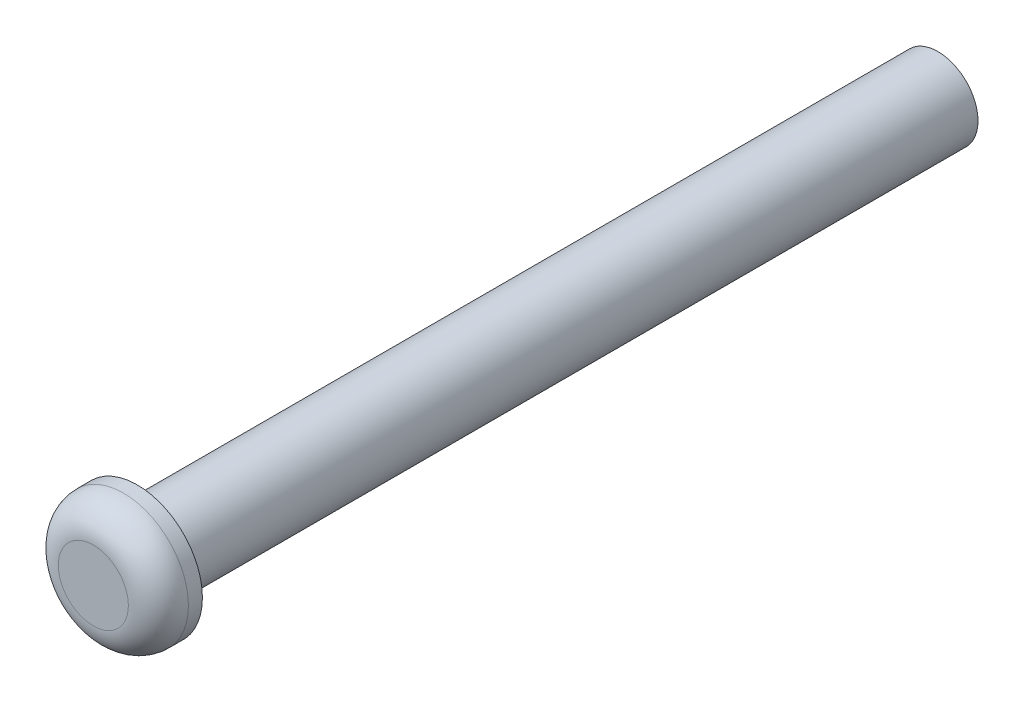
ISO-10303-21;
HEADER;
FILE_DESCRIPTION(('STEP AP214'),'2;1');
FILE_NAME('part.step','',(''),(''),'','','');
FILE_SCHEMA(('AUTOMOTIVE_DESIGN { 1 0 10303 214 1 1 1 1 }'));
ENDSEC;
DATA;
#1=APPLICATION_CONTEXT('core data for automotive mechanical design processes');
#2=APPLICATION_PROTOCOL_DEFINITION('international standard','automotive_design',2000,#1);
#3=PRODUCT_CONTEXT('',#1,'mechanical');
#4=PRODUCT('Part','Part','',(#3));
#5=PRODUCT_RELATED_PRODUCT_CATEGORY('part','',(#4));
#6=PRODUCT_DEFINITION_FORMATION('','',#4);
#7=PRODUCT_DEFINITION_CONTEXT('part definition',#1,'design');
#8=PRODUCT_DEFINITION('design','',#6,#7);
#9=PRODUCT_DEFINITION_SHAPE('','',#8);
#10=(LENGTH_UNIT() NAMED_UNIT(*) SI_UNIT(.MILLI.,.METRE.));
#11=(NAMED_UNIT(*) PLANE_ANGLE_UNIT() SI_UNIT($,.RADIAN.));
#12=(NAMED_UNIT(*) SI_UNIT($,.STERADIAN.) SOLID_ANGLE_UNIT());
#13=UNCERTAINTY_MEASURE_WITH_UNIT(LENGTH_MEASURE(1.E-05),#10,'distance_accuracy_value','');
#14=(GEOMETRIC_REPRESENTATION_CONTEXT(3) GLOBAL_UNCERTAINTY_ASSIGNED_CONTEXT((#13)) GLOBAL_UNIT_ASSIGNED_CONTEXT((#10,
#11,#12)) REPRESENTATION_CONTEXT('',''));
#15=CARTESIAN_POINT('',(0.,0.,0.));
#16=DIRECTION('',(0.,0.,1.));
#17=DIRECTION('',(1.,0.,0.));
#18=AXIS2_PLACEMENT_3D('',#15,#16,#17);
#19=CARTESIAN_POINT('',(0.,0.,40.));
#20=DIRECTION('',(0.,0.,-1.));
#21=DIRECTION('',(-1.,0.,0.));
#22=AXIS2_PLACEMENT_3D('',#19,#20,#21);
#23=CYLINDRICAL_SURFACE('',#22,2.);
#24=CARTESIAN_POINT('',(0.,0.,40.));
#25=DIRECTION('',(0.,0.,1.));
#26=DIRECTION('',(1.,0.,0.));
#27=AXIS2_PLACEMENT_3D('',#24,#25,#26);
#28=CIRCLE('',#27,2.);
#29=CARTESIAN_POINT('',(2.,0.,40.));
#30=VERTEX_POINT('',#29);
#31=EDGE_CURVE('E42',#30,#30,#28,.T.);
#32=ORIENTED_EDGE('',*,*,#31,.F.);
#33=EDGE_LOOP('',(#32));
#34=FACE_BOUND('',#33,.T.);
#35=CARTESIAN_POINT('',(0.,0.,0.));
#36=DIRECTION('',(0.,0.,1.));
#37=DIRECTION('',(1.,0.,0.));
#38=AXIS2_PLACEMENT_3D('',#35,#36,#37);
#39=CIRCLE('',#38,2.);
#40=CARTESIAN_POINT('',(2.,0.,0.));
#41=VERTEX_POINT('',#40);
#42=EDGE_CURVE('E46',#41,#41,#39,.T.);
#43=ORIENTED_EDGE('',*,*,#42,.T.);
#44=EDGE_LOOP('',(#43));
#45=FACE_BOUND('',#44,.T.);
#46=ADVANCED_FACE('F31',(#34,#45),#23,.T.);
#47=CARTESIAN_POINT('',(0.,0.,0.));
#48=DIRECTION('',(0.,0.,1.));
#49=DIRECTION('',(1.,0.,0.));
#50=AXIS2_PLACEMENT_3D('',#47,#48,#49);
#51=PLANE('',#50);
#52=ORIENTED_EDGE('',*,*,#42,.F.);
#53=EDGE_LOOP('',(#52));
#54=FACE_BOUND('',#53,.T.);
#55=ADVANCED_FACE('F70',(#54),#51,.F.);
#56=CARTESIAN_POINT('',(0.,0.,42.2));
#57=DIRECTION('',(0.,0.,-1.));
#58=DIRECTION('',(-1.,0.,0.));
#59=AXIS2_PLACEMENT_3D('',#56,#57,#58);
#60=CYLINDRICAL_SURFACE('',#59,3.25);
#61=CARTESIAN_POINT('',(0.,0.,40.7));
#62=DIRECTION('',(0.,0.,1.));
#63=DIRECTION('',(1.,0.,0.));
#64=AXIS2_PLACEMENT_3D('',#61,#62,#63);
#65=CIRCLE('',#64,3.25);
#66=CARTESIAN_POINT('',(3.25,0.,40.7));
#67=VERTEX_POINT('',#66);
#68=EDGE_CURVE('E10',#67,#67,#65,.F.);
#69=ORIENTED_EDGE('',*,*,#68,.T.);
#70=EDGE_LOOP('',(#69));
#71=FACE_BOUND('',#70,.T.);
#72=CARTESIAN_POINT('',(0.,0.,40.));
#73=DIRECTION('',(0.,0.,1.));
#74=DIRECTION('',(1.,0.,0.));
#75=AXIS2_PLACEMENT_3D('',#72,#73,#74);
#76=CIRCLE('',#75,3.25);
#77=CARTESIAN_POINT('',(3.25,0.,40.));
#78=VERTEX_POINT('',#77);
#79=EDGE_CURVE('E50',#78,#78,#76,.T.);
#80=ORIENTED_EDGE('',*,*,#79,.T.);
#81=EDGE_LOOP('',(#80));
#82=FACE_BOUND('',#81,.T.);
#83=ADVANCED_FACE('F55',(#71,#82),#60,.T.);
#84=CARTESIAN_POINT('',(0.,0.,42.2));
#85=DIRECTION('',(0.,0.,1.));
#86=DIRECTION('',(1.,0.,0.));
#87=AXIS2_PLACEMENT_3D('',#84,#85,#86);
#88=PLANE('',#87);
#89=CARTESIAN_POINT('',(0.,0.,42.2));
#90=DIRECTION('',(0.,0.,1.));
#91=DIRECTION('',(1.,0.,0.));
#92=AXIS2_PLACEMENT_3D('',#89,#90,#91);
#93=CIRCLE('',#92,1.75);
#94=CARTESIAN_POINT('',(1.75,0.,42.2));
#95=VERTEX_POINT('',#94);
#96=EDGE_CURVE('E38',#95,#95,#93,.T.);
#97=ORIENTED_EDGE('',*,*,#96,.T.);
#98=EDGE_LOOP('',(#97));
#99=FACE_BOUND('',#98,.T.);
#100=ADVANCED_FACE('F59',(#99),#88,.T.);
#101=CARTESIAN_POINT('',(0.,0.,40.));
#102=DIRECTION('',(0.,0.,1.));
#103=DIRECTION('',(1.,0.,0.));
#104=AXIS2_PLACEMENT_3D('',#101,#102,#103);
#105=PLANE('',#104);
#106=ORIENTED_EDGE('',*,*,#31,.T.);
#107=EDGE_LOOP('',(#106));
#108=FACE_BOUND('',#107,.T.);
#109=ORIENTED_EDGE('',*,*,#79,.F.);
#110=EDGE_LOOP('',(#109));
#111=FACE_BOUND('',#110,.T.);
#112=ADVANCED_FACE('F57',(#108,#111),#105,.F.);
#113=CARTESIAN_POINT('',(0.,0.,40.7));
#114=DIRECTION('',(0.,0.,1.));
#115=DIRECTION('',(1.,0.,0.));
#116=AXIS2_PLACEMENT_3D('',#113,#114,#115);
#117=TOROIDAL_SURFACE('',#116,1.75,1.5);
#118=ORIENTED_EDGE('',*,*,#68,.F.);
#119=EDGE_LOOP('',(#118));
#120=FACE_BOUND('',#119,.T.);
#121=ORIENTED_EDGE('',*,*,#96,.F.);
#122=EDGE_LOOP('',(#121));
#123=FACE_BOUND('',#122,.T.);
#124=ADVANCED_FACE('F33',(#120,#123),#117,.T.);
#125=CLOSED_SHELL('',(#46,#55,#83,#100,#112,#124));
#126=MANIFOLD_SOLID_BREP('B2',#125);
#127=ADVANCED_BREP_SHAPE_REPRESENTATION('',(#18,#126),#14);
#128=SHAPE_DEFINITION_REPRESENTATION(#9,#127);
ENDSEC;
END-ISO-10303-21;
